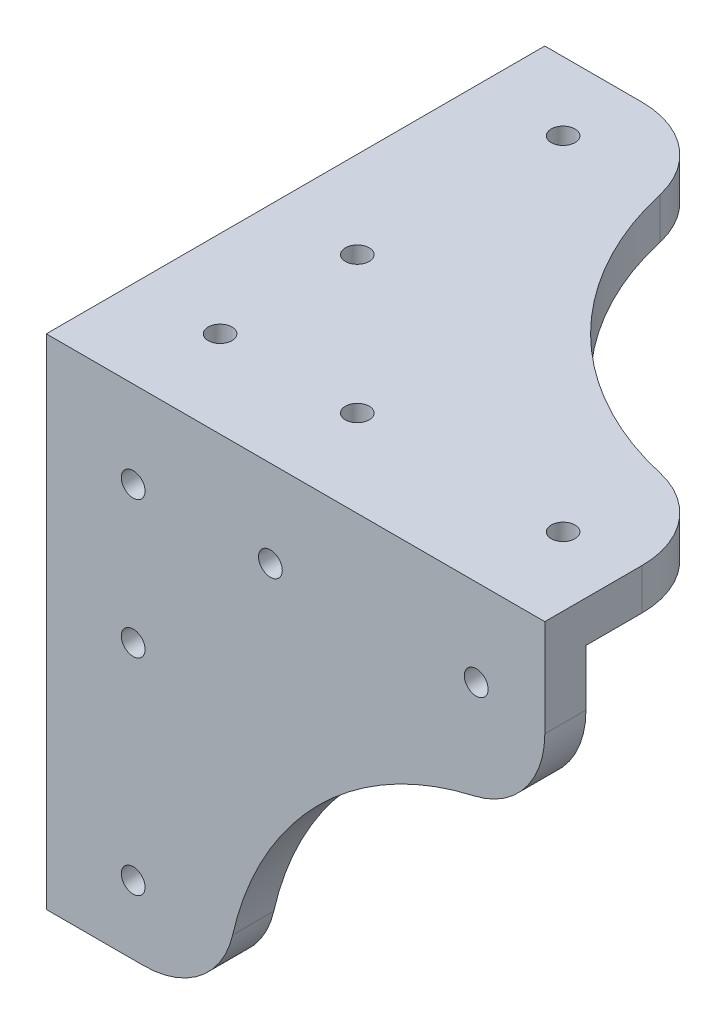
ISO-10303-21;
HEADER;
FILE_DESCRIPTION(('STEP AP214'),'2;1');
FILE_NAME('part.step','',(''),(''),'','','');
FILE_SCHEMA(('AUTOMOTIVE_DESIGN { 1 0 10303 214 1 1 1 1 }'));
ENDSEC;
DATA;
#1=APPLICATION_CONTEXT('core data for automotive mechanical design processes');
#2=APPLICATION_PROTOCOL_DEFINITION('international standard','automotive_design',2000,#1);
#3=PRODUCT_CONTEXT('',#1,'mechanical');
#4=PRODUCT('Part','Part','',(#3));
#5=PRODUCT_RELATED_PRODUCT_CATEGORY('part','',(#4));
#6=PRODUCT_DEFINITION_FORMATION('','',#4);
#7=PRODUCT_DEFINITION_CONTEXT('part definition',#1,'design');
#8=PRODUCT_DEFINITION('design','',#6,#7);
#9=PRODUCT_DEFINITION_SHAPE('','',#8);
#10=(LENGTH_UNIT() NAMED_UNIT(*) SI_UNIT(.MILLI.,.METRE.));
#11=(NAMED_UNIT(*) PLANE_ANGLE_UNIT() SI_UNIT($,.RADIAN.));
#12=(NAMED_UNIT(*) SI_UNIT($,.STERADIAN.) SOLID_ANGLE_UNIT());
#13=UNCERTAINTY_MEASURE_WITH_UNIT(LENGTH_MEASURE(1.E-05),#10,'distance_accuracy_value','');
#14=(GEOMETRIC_REPRESENTATION_CONTEXT(3) GLOBAL_UNCERTAINTY_ASSIGNED_CONTEXT((#13)) GLOBAL_UNIT_ASSIGNED_CONTEXT((#10,
#11,#12)) REPRESENTATION_CONTEXT('',''));
#15=CARTESIAN_POINT('',(0.,0.,0.));
#16=DIRECTION('',(0.,0.,1.));
#17=DIRECTION('',(1.,0.,0.));
#18=AXIS2_PLACEMENT_3D('',#15,#16,#17);
#19=CARTESIAN_POINT('',(109.,-109.,0.));
#20=DIRECTION('',(0.,0.,-1.));
#21=DIRECTION('',(-1.,0.,0.));
#22=AXIS2_PLACEMENT_3D('',#19,#20,#21);
#23=PLANE('',#22);
#24=CARTESIAN_POINT('',(19.,-94.,0.));
#25=DIRECTION('',(0.,0.,-1.));
#26=DIRECTION('',(-1.,0.,0.));
#27=AXIS2_PLACEMENT_3D('',#24,#25,#26);
#28=CIRCLE('',#27,2.6);
#29=CARTESIAN_POINT('',(16.4,-94.,0.));
#30=VERTEX_POINT('',#29);
#31=EDGE_CURVE('E507',#30,#30,#28,.T.);
#32=ORIENTED_EDGE('',*,*,#31,.F.);
#33=EDGE_LOOP('',(#32));
#34=FACE_BOUND('',#33,.T.);
#35=CARTESIAN_POINT('',(19.,-49.,0.));
#36=DIRECTION('',(0.,0.,-1.));
#37=DIRECTION('',(-1.,0.,0.));
#38=AXIS2_PLACEMENT_3D('',#35,#36,#37);
#39=CIRCLE('',#38,2.6);
#40=CARTESIAN_POINT('',(16.4,-49.,0.));
#41=VERTEX_POINT('',#40);
#42=EDGE_CURVE('E517',#41,#41,#39,.T.);
#43=ORIENTED_EDGE('',*,*,#42,.F.);
#44=EDGE_LOOP('',(#43));
#45=FACE_BOUND('',#44,.T.);
#46=CARTESIAN_POINT('',(94.,-19.,0.));
#47=DIRECTION('',(0.,0.,-1.));
#48=DIRECTION('',(-1.,0.,0.));
#49=AXIS2_PLACEMENT_3D('',#46,#47,#48);
#50=CIRCLE('',#49,2.6);
#51=CARTESIAN_POINT('',(91.4,-19.,0.));
#52=VERTEX_POINT('',#51);
#53=EDGE_CURVE('E523',#52,#52,#50,.T.);
#54=ORIENTED_EDGE('',*,*,#53,.F.);
#55=EDGE_LOOP('',(#54));
#56=FACE_BOUND('',#55,.T.);
#57=CARTESIAN_POINT('',(49.,-19.,0.));
#58=DIRECTION('',(0.,0.,-1.));
#59=DIRECTION('',(-1.,0.,0.));
#60=AXIS2_PLACEMENT_3D('',#57,#58,#59);
#61=CIRCLE('',#60,2.6);
#62=CARTESIAN_POINT('',(46.4,-19.,0.));
#63=VERTEX_POINT('',#62);
#64=EDGE_CURVE('E529',#63,#63,#61,.T.);
#65=ORIENTED_EDGE('',*,*,#64,.F.);
#66=EDGE_LOOP('',(#65));
#67=FACE_BOUND('',#66,.T.);
#68=CARTESIAN_POINT('',(19.,-19.,0.));
#69=DIRECTION('',(0.,0.,-1.));
#70=DIRECTION('',(-1.,0.,0.));
#71=AXIS2_PLACEMENT_3D('',#68,#69,#70);
#72=CIRCLE('',#71,2.6);
#73=CARTESIAN_POINT('',(16.4,-19.,0.));
#74=VERTEX_POINT('',#73);
#75=EDGE_CURVE('E534',#74,#74,#72,.T.);
#76=ORIENTED_EDGE('',*,*,#75,.F.);
#77=EDGE_LOOP('',(#76));
#78=FACE_BOUND('',#77,.T.);
#79=CARTESIAN_POINT('',(109.,-109.,0.));
#80=DIRECTION('',(0.,0.,-1.));
#81=DIRECTION('',(-1.,0.,0.));
#82=AXIS2_PLACEMENT_3D('',#79,#80,#81);
#83=CIRCLE('',#82,70.);
#84=CARTESIAN_POINT('',(40.7502769869501,-93.4444444444444,0.));
#85=VERTEX_POINT('',#84);
#86=CARTESIAN_POINT('',(93.4444444444444,-40.7502769869501,0.));
#87=VERTEX_POINT('',#86);
#88=EDGE_CURVE('E174',#85,#87,#83,.T.);
#89=ORIENTED_EDGE('',*,*,#88,.F.);
#90=CARTESIAN_POINT('',(21.2503561260788,-89.,0.));
#91=DIRECTION('',(0.,0.,-1.));
#92=DIRECTION('',(-1.,0.,0.));
#93=AXIS2_PLACEMENT_3D('',#90,#91,#92);
#94=CIRCLE('',#93,20.);
#95=CARTESIAN_POINT('',(21.2503561260788,-109.,0.));
#96=VERTEX_POINT('',#95);
#97=EDGE_CURVE('E173',#85,#96,#94,.T.);
#98=ORIENTED_EDGE('',*,*,#97,.T.);
#99=DIRECTION('',(1.,0.,0.));
#100=VECTOR('',#99,1.);
#101=CARTESIAN_POINT('',(0.,-109.,0.));
#102=LINE('',#101,#100);
#103=CARTESIAN_POINT('',(9.,-109.,0.));
#104=VERTEX_POINT('',#103);
#105=EDGE_CURVE('E154',#104,#96,#102,.T.);
#106=ORIENTED_EDGE('',*,*,#105,.F.);
#107=DIRECTION('',(0.,1.,0.));
#108=VECTOR('',#107,1.);
#109=CARTESIAN_POINT('',(9.,-109.,0.));
#110=LINE('',#109,#108);
#111=CARTESIAN_POINT('',(9.,-9.,0.));
#112=VERTEX_POINT('',#111);
#113=EDGE_CURVE('E160',#104,#112,#110,.T.);
#114=ORIENTED_EDGE('',*,*,#113,.T.);
#115=DIRECTION('',(1.,0.,0.));
#116=VECTOR('',#115,1.);
#117=CARTESIAN_POINT('',(0.,-9.,0.));
#118=LINE('',#117,#116);
#119=CARTESIAN_POINT('',(109.,-9.,0.));
#120=VERTEX_POINT('',#119);
#121=EDGE_CURVE('E280',#112,#120,#118,.T.);
#122=ORIENTED_EDGE('',*,*,#121,.T.);
#123=DIRECTION('',(0.,1.,0.));
#124=VECTOR('',#123,1.);
#125=CARTESIAN_POINT('',(109.,0.,0.));
#126=LINE('',#125,#124);
#127=CARTESIAN_POINT('',(109.,-21.2503561260788,0.));
#128=VERTEX_POINT('',#127);
#129=EDGE_CURVE('E178',#128,#120,#126,.T.);
#130=ORIENTED_EDGE('',*,*,#129,.F.);
#131=CARTESIAN_POINT('',(89.,-21.2503561260788,0.));
#132=DIRECTION('',(0.,0.,-1.));
#133=DIRECTION('',(-1.,0.,0.));
#134=AXIS2_PLACEMENT_3D('',#131,#132,#133);
#135=CIRCLE('',#134,20.);
#136=EDGE_CURVE('E58',#128,#87,#135,.T.);
#137=ORIENTED_EDGE('',*,*,#136,.T.);
#138=EDGE_LOOP('',(#89,#98,#106,#114,#122,#130,#137));
#139=FACE_BOUND('',#138,.T.);
#140=ADVANCED_FACE('F33',(#34,#45,#56,#67,#78,#139),#23,.T.);
#141=CARTESIAN_POINT('',(0.,0.,9.));
#142=DIRECTION('',(1.,0.,0.));
#143=DIRECTION('',(0.,0.,-1.));
#144=AXIS2_PLACEMENT_3D('',#141,#142,#143);
#145=PLANE('',#144);
#146=CARTESIAN_POINT('',(0.,-94.,-9.99999999999999));
#147=DIRECTION('',(-1.,0.,0.));
#148=DIRECTION('',(0.,0.,1.));
#149=AXIS2_PLACEMENT_3D('',#146,#147,#148);
#150=CIRCLE('',#149,2.6);
#151=CARTESIAN_POINT('',(0.,-94.,-7.39999999999999));
#152=VERTEX_POINT('',#151);
#153=EDGE_CURVE('E248',#152,#152,#150,.T.);
#154=ORIENTED_EDGE('',*,*,#153,.F.);
#155=EDGE_LOOP('',(#154));
#156=FACE_BOUND('',#155,.T.);
#157=CARTESIAN_POINT('',(0.,-49.,-9.99999999999999));
#158=DIRECTION('',(-1.,0.,0.));
#159=DIRECTION('',(0.,0.,1.));
#160=AXIS2_PLACEMENT_3D('',#157,#158,#159);
#161=CIRCLE('',#160,2.6);
#162=CARTESIAN_POINT('',(0.,-49.,-7.4));
#163=VERTEX_POINT('',#162);
#164=EDGE_CURVE('E238',#163,#163,#161,.T.);
#165=ORIENTED_EDGE('',*,*,#164,.F.);
#166=EDGE_LOOP('',(#165));
#167=FACE_BOUND('',#166,.T.);
#168=CARTESIAN_POINT('',(0.,-19.,-10.));
#169=DIRECTION('',(-1.,0.,0.));
#170=DIRECTION('',(0.,0.,1.));
#171=AXIS2_PLACEMENT_3D('',#168,#169,#170);
#172=CIRCLE('',#171,2.6);
#173=CARTESIAN_POINT('',(0.,-19.,-7.4));
#174=VERTEX_POINT('',#173);
#175=EDGE_CURVE('E235',#174,#174,#172,.T.);
#176=ORIENTED_EDGE('',*,*,#175,.F.);
#177=EDGE_LOOP('',(#176));
#178=FACE_BOUND('',#177,.T.);
#179=CARTESIAN_POINT('',(0.,-19.,-40.));
#180=DIRECTION('',(-1.,0.,0.));
#181=DIRECTION('',(0.,0.,1.));
#182=AXIS2_PLACEMENT_3D('',#179,#180,#181);
#183=CIRCLE('',#182,2.6);
#184=CARTESIAN_POINT('',(0.,-19.,-37.4));
#185=VERTEX_POINT('',#184);
#186=EDGE_CURVE('E232',#185,#185,#183,.T.);
#187=ORIENTED_EDGE('',*,*,#186,.F.);
#188=EDGE_LOOP('',(#187));
#189=FACE_BOUND('',#188,.T.);
#190=CARTESIAN_POINT('',(0.,-19.,-85.));
#191=DIRECTION('',(-1.,0.,0.));
#192=DIRECTION('',(0.,0.,1.));
#193=AXIS2_PLACEMENT_3D('',#190,#191,#192);
#194=CIRCLE('',#193,2.6);
#195=CARTESIAN_POINT('',(0.,-19.,-82.4));
#196=VERTEX_POINT('',#195);
#197=EDGE_CURVE('E228',#196,#196,#194,.T.);
#198=ORIENTED_EDGE('',*,*,#197,.F.);
#199=EDGE_LOOP('',(#198));
#200=FACE_BOUND('',#199,.T.);
#201=CARTESIAN_POINT('',(0.,-109.,-100.));
#202=DIRECTION('',(1.,0.,0.));
#203=DIRECTION('',(0.,0.,-1.));
#204=AXIS2_PLACEMENT_3D('',#201,#202,#203);
#205=CIRCLE('',#204,70.);
#206=CARTESIAN_POINT('',(0.,-40.7502769869501,-84.4444444444444));
#207=VERTEX_POINT('',#206);
#208=CARTESIAN_POINT('',(0.,-93.4444444444444,-31.7502769869502));
#209=VERTEX_POINT('',#208);
#210=EDGE_CURVE('E207',#207,#209,#205,.T.);
#211=ORIENTED_EDGE('',*,*,#210,.T.);
#212=CARTESIAN_POINT('',(0.,-89.,-12.2503561260788));
#213=DIRECTION('',(1.,0.,0.));
#214=DIRECTION('',(0.,0.,-1.));
#215=AXIS2_PLACEMENT_3D('',#212,#213,#214);
#216=CIRCLE('',#215,20.);
#217=CARTESIAN_POINT('',(0.,-109.,-12.2503561260788));
#218=VERTEX_POINT('',#217);
#219=EDGE_CURVE('E295',#209,#218,#216,.F.);
#220=ORIENTED_EDGE('',*,*,#219,.T.);
#221=DIRECTION('',(0.,0.,-1.));
#222=VECTOR('',#221,1.);
#223=CARTESIAN_POINT('',(0.,-109.,9.));
#224=LINE('',#223,#222);
#225=CARTESIAN_POINT('',(0.,-109.,9.));
#226=VERTEX_POINT('',#225);
#227=EDGE_CURVE('E290',#226,#218,#224,.T.);
#228=ORIENTED_EDGE('',*,*,#227,.F.);
#229=DIRECTION('',(0.,-1.,0.));
#230=VECTOR('',#229,1.);
#231=CARTESIAN_POINT('',(0.,0.,9.));
#232=LINE('',#231,#230);
#233=CARTESIAN_POINT('',(0.,0.,9.));
#234=VERTEX_POINT('',#233);
#235=EDGE_CURVE('E194',#234,#226,#232,.T.);
#236=ORIENTED_EDGE('',*,*,#235,.F.);
#237=DIRECTION('',(0.,0.,-1.));
#238=VECTOR('',#237,1.);
#239=CARTESIAN_POINT('',(0.,0.,9.));
#240=LINE('',#239,#238);
#241=CARTESIAN_POINT('',(0.,0.,-100.));
#242=VERTEX_POINT('',#241);
#243=EDGE_CURVE('E189',#234,#242,#240,.T.);
#244=ORIENTED_EDGE('',*,*,#243,.T.);
#245=DIRECTION('',(0.,1.,0.));
#246=VECTOR('',#245,1.);
#247=CARTESIAN_POINT('',(0.,-9.,-100.));
#248=LINE('',#247,#246);
#249=CARTESIAN_POINT('',(0.,-21.2503561260788,-100.));
#250=VERTEX_POINT('',#249);
#251=EDGE_CURVE('E175',#250,#242,#248,.T.);
#252=ORIENTED_EDGE('',*,*,#251,.F.);
#253=CARTESIAN_POINT('',(0.,-21.2503561260788,-80.));
#254=DIRECTION('',(1.,0.,0.));
#255=DIRECTION('',(0.,0.,-1.));
#256=AXIS2_PLACEMENT_3D('',#253,#254,#255);
#257=CIRCLE('',#256,20.);
#258=EDGE_CURVE('E293',#250,#207,#257,.F.);
#259=ORIENTED_EDGE('',*,*,#258,.T.);
#260=EDGE_LOOP('',(#211,#220,#228,#236,#244,#252,#259));
#261=FACE_BOUND('',#260,.T.);
#262=ADVANCED_FACE('F350',(#156,#167,#178,#189,#200,#261),#145,.F.);
#263=CARTESIAN_POINT('',(0.,-109.,9.));
#264=DIRECTION('',(0.,1.,0.));
#265=DIRECTION('',(0.,0.,1.));
#266=AXIS2_PLACEMENT_3D('',#263,#264,#265);
#267=PLANE('',#266);
#268=ORIENTED_EDGE('',*,*,#227,.T.);
#269=DIRECTION('',(1.,0.,0.));
#270=VECTOR('',#269,1.);
#271=CARTESIAN_POINT('',(9.,-109.,-12.2503561260788));
#272=LINE('',#271,#270);
#273=CARTESIAN_POINT('',(9.,-109.,-12.2503561260788));
#274=VERTEX_POINT('',#273);
#275=EDGE_CURVE('E157',#218,#274,#272,.T.);
#276=ORIENTED_EDGE('',*,*,#275,.T.);
#277=DIRECTION('',(0.,0.,1.));
#278=VECTOR('',#277,1.);
#279=CARTESIAN_POINT('',(9.,-109.,-30.));
#280=LINE('',#279,#278);
#281=EDGE_CURVE('E149',#274,#104,#280,.T.);
#282=ORIENTED_EDGE('',*,*,#281,.T.);
#283=ORIENTED_EDGE('',*,*,#105,.T.);
#284=DIRECTION('',(0.,0.,-1.));
#285=VECTOR('',#284,1.);
#286=CARTESIAN_POINT('',(21.2503561260788,-109.,9.));
#287=LINE('',#286,#285);
#288=CARTESIAN_POINT('',(21.2503561260788,-109.,9.));
#289=VERTEX_POINT('',#288);
#290=EDGE_CURVE('E297',#96,#289,#287,.F.);
#291=ORIENTED_EDGE('',*,*,#290,.T.);
#292=DIRECTION('',(1.,0.,0.));
#293=VECTOR('',#292,1.);
#294=CARTESIAN_POINT('',(0.,-109.,9.));
#295=LINE('',#294,#293);
#296=EDGE_CURVE('E411',#226,#289,#295,.T.);
#297=ORIENTED_EDGE('',*,*,#296,.F.);
#298=EDGE_LOOP('',(#268,#276,#282,#283,#291,#297));
#299=FACE_BOUND('',#298,.T.);
#300=ADVANCED_FACE('F152',(#299),#267,.F.);
#301=CARTESIAN_POINT('',(109.,-109.,9.));
#302=DIRECTION('',(0.,0.,-1.));
#303=DIRECTION('',(-1.,0.,0.));
#304=AXIS2_PLACEMENT_3D('',#301,#302,#303);
#305=CYLINDRICAL_SURFACE('',#304,70.);
#306=CARTESIAN_POINT('',(109.,-109.,9.));
#307=DIRECTION('',(0.,0.,-1.));
#308=DIRECTION('',(-1.,0.,0.));
#309=AXIS2_PLACEMENT_3D('',#306,#307,#308);
#310=CIRCLE('',#309,70.);
#311=CARTESIAN_POINT('',(40.7502769869501,-93.4444444444444,9.));
#312=VERTEX_POINT('',#311);
#313=CARTESIAN_POINT('',(93.4444444444444,-40.7502769869501,9.));
#314=VERTEX_POINT('',#313);
#315=EDGE_CURVE('E327',#312,#314,#310,.T.);
#316=ORIENTED_EDGE('',*,*,#315,.F.);
#317=DIRECTION('',(0.,0.,-1.));
#318=VECTOR('',#317,1.);
#319=CARTESIAN_POINT('',(40.7502769869501,-93.4444444444444,9.));
#320=LINE('',#319,#318);
#321=EDGE_CURVE('E195',#312,#85,#320,.T.);
#322=ORIENTED_EDGE('',*,*,#321,.T.);
#323=ORIENTED_EDGE('',*,*,#88,.T.);
#324=DIRECTION('',(0.,0.,-1.));
#325=VECTOR('',#324,1.);
#326=CARTESIAN_POINT('',(93.4444444444444,-40.7502769869501,9.));
#327=LINE('',#326,#325);
#328=EDGE_CURVE('E321',#87,#314,#327,.F.);
#329=ORIENTED_EDGE('',*,*,#328,.T.);
#330=EDGE_LOOP('',(#316,#322,#323,#329));
#331=FACE_BOUND('',#330,.T.);
#332=ADVANCED_FACE('F326',(#331),#305,.F.);
#333=CARTESIAN_POINT('',(109.,0.,9.));
#334=DIRECTION('',(-1.,0.,0.));
#335=DIRECTION('',(0.,0.,1.));
#336=AXIS2_PLACEMENT_3D('',#333,#334,#335);
#337=PLANE('',#336);
#338=DIRECTION('',(0.,1.,0.));
#339=VECTOR('',#338,1.);
#340=CARTESIAN_POINT('',(109.,0.,9.));
#341=LINE('',#340,#339);
#342=CARTESIAN_POINT('',(109.,-21.2503561260788,9.));
#343=VERTEX_POINT('',#342);
#344=CARTESIAN_POINT('',(109.,0.,9.));
#345=VERTEX_POINT('',#344);
#346=EDGE_CURVE('E337',#343,#345,#341,.T.);
#347=ORIENTED_EDGE('',*,*,#346,.F.);
#348=DIRECTION('',(0.,0.,-1.));
#349=VECTOR('',#348,1.);
#350=CARTESIAN_POINT('',(109.,-21.2503561260788,9.));
#351=LINE('',#350,#349);
#352=EDGE_CURVE('E11',#343,#128,#351,.T.);
#353=ORIENTED_EDGE('',*,*,#352,.T.);
#354=ORIENTED_EDGE('',*,*,#129,.T.);
#355=DIRECTION('',(0.,0.,-1.));
#356=VECTOR('',#355,1.);
#357=CARTESIAN_POINT('',(109.,-9.,0.));
#358=LINE('',#357,#356);
#359=CARTESIAN_POINT('',(109.,-9.,-12.2503561260788));
#360=VERTEX_POINT('',#359);
#361=EDGE_CURVE('E283',#120,#360,#358,.T.);
#362=ORIENTED_EDGE('',*,*,#361,.T.);
#363=DIRECTION('',(0.,-1.,0.));
#364=VECTOR('',#363,1.);
#365=CARTESIAN_POINT('',(109.,0.,-12.2503561260788));
#366=LINE('',#365,#364);
#367=CARTESIAN_POINT('',(109.,0.,-12.2503561260788));
#368=VERTEX_POINT('',#367);
#369=EDGE_CURVE('E42',#360,#368,#366,.F.);
#370=ORIENTED_EDGE('',*,*,#369,.T.);
#371=DIRECTION('',(0.,0.,-1.));
#372=VECTOR('',#371,1.);
#373=CARTESIAN_POINT('',(109.,0.,9.));
#374=LINE('',#373,#372);
#375=EDGE_CURVE('E401',#345,#368,#374,.T.);
#376=ORIENTED_EDGE('',*,*,#375,.F.);
#377=EDGE_LOOP('',(#347,#353,#354,#362,#370,#376));
#378=FACE_BOUND('',#377,.T.);
#379=ADVANCED_FACE('F334',(#378),#337,.F.);
#380=CARTESIAN_POINT('',(0.,0.,9.));
#381=DIRECTION('',(0.,-1.,0.));
#382=DIRECTION('',(0.,0.,-1.));
#383=AXIS2_PLACEMENT_3D('',#380,#381,#382);
#384=PLANE('',#383);
#385=CARTESIAN_POINT('',(19.,0.,-40.));
#386=DIRECTION('',(0.,1.,0.));
#387=DIRECTION('',(0.,0.,1.));
#388=AXIS2_PLACEMENT_3D('',#385,#386,#387);
#389=CIRCLE('',#388,2.6);
#390=CARTESIAN_POINT('',(19.,0.,-37.4));
#391=VERTEX_POINT('',#390);
#392=EDGE_CURVE('E224',#391,#391,#389,.T.);
#393=ORIENTED_EDGE('',*,*,#392,.F.);
#394=EDGE_LOOP('',(#393));
#395=FACE_BOUND('',#394,.T.);
#396=CARTESIAN_POINT('',(49.,0.,-9.99999999999999));
#397=DIRECTION('',(0.,1.,0.));
#398=DIRECTION('',(0.,0.,1.));
#399=AXIS2_PLACEMENT_3D('',#396,#397,#398);
#400=CIRCLE('',#399,2.6);
#401=CARTESIAN_POINT('',(49.,0.,-7.39999999999999));
#402=VERTEX_POINT('',#401);
#403=EDGE_CURVE('E220',#402,#402,#400,.T.);
#404=ORIENTED_EDGE('',*,*,#403,.F.);
#405=EDGE_LOOP('',(#404));
#406=FACE_BOUND('',#405,.T.);
#407=CARTESIAN_POINT('',(94.,0.,-10.));
#408=DIRECTION('',(0.,1.,0.));
#409=DIRECTION('',(0.,0.,1.));
#410=AXIS2_PLACEMENT_3D('',#407,#408,#409);
#411=CIRCLE('',#410,2.6);
#412=CARTESIAN_POINT('',(94.,0.,-7.39999999999999));
#413=VERTEX_POINT('',#412);
#414=EDGE_CURVE('E216',#413,#413,#411,.T.);
#415=ORIENTED_EDGE('',*,*,#414,.F.);
#416=EDGE_LOOP('',(#415));
#417=FACE_BOUND('',#416,.T.);
#418=CARTESIAN_POINT('',(19.,0.,-9.99999999999998));
#419=DIRECTION('',(0.,1.,0.));
#420=DIRECTION('',(0.,0.,1.));
#421=AXIS2_PLACEMENT_3D('',#418,#419,#420);
#422=CIRCLE('',#421,2.6);
#423=CARTESIAN_POINT('',(19.,0.,-7.39999999999998));
#424=VERTEX_POINT('',#423);
#425=EDGE_CURVE('E212',#424,#424,#422,.T.);
#426=ORIENTED_EDGE('',*,*,#425,.F.);
#427=EDGE_LOOP('',(#426));
#428=FACE_BOUND('',#427,.T.);
#429=CARTESIAN_POINT('',(19.,0.,-85.));
#430=DIRECTION('',(0.,1.,0.));
#431=DIRECTION('',(0.,0.,1.));
#432=AXIS2_PLACEMENT_3D('',#429,#430,#431);
#433=CIRCLE('',#432,2.6);
#434=CARTESIAN_POINT('',(19.,0.,-82.4));
#435=VERTEX_POINT('',#434);
#436=EDGE_CURVE('E208',#435,#435,#433,.T.);
#437=ORIENTED_EDGE('',*,*,#436,.F.);
#438=EDGE_LOOP('',(#437));
#439=FACE_BOUND('',#438,.T.);
#440=CARTESIAN_POINT('',(109.,0.,-100.));
#441=DIRECTION('',(0.,-1.,0.));
#442=DIRECTION('',(0.,0.,1.));
#443=AXIS2_PLACEMENT_3D('',#440,#441,#442);
#444=CIRCLE('',#443,70.);
#445=CARTESIAN_POINT('',(93.4444444444444,0.,-31.7502769869502));
#446=VERTEX_POINT('',#445);
#447=CARTESIAN_POINT('',(40.7502769869501,0.,-84.4444444444444));
#448=VERTEX_POINT('',#447);
#449=EDGE_CURVE('E272',#446,#448,#444,.T.);
#450=ORIENTED_EDGE('',*,*,#449,.T.);
#451=CARTESIAN_POINT('',(21.2503561260788,0.,-80.));
#452=DIRECTION('',(0.,-1.,0.));
#453=DIRECTION('',(0.,0.,-1.));
#454=AXIS2_PLACEMENT_3D('',#451,#452,#453);
#455=CIRCLE('',#454,20.);
#456=CARTESIAN_POINT('',(21.2503561260788,0.,-100.));
#457=VERTEX_POINT('',#456);
#458=EDGE_CURVE('E316',#448,#457,#455,.F.);
#459=ORIENTED_EDGE('',*,*,#458,.T.);
#460=DIRECTION('',(-1.,0.,0.));
#461=VECTOR('',#460,1.);
#462=CARTESIAN_POINT('',(0.,0.,-100.));
#463=LINE('',#462,#461);
#464=EDGE_CURVE('E284',#457,#242,#463,.T.);
#465=ORIENTED_EDGE('',*,*,#464,.T.);
#466=ORIENTED_EDGE('',*,*,#243,.F.);
#467=DIRECTION('',(-1.,0.,0.));
#468=VECTOR('',#467,1.);
#469=CARTESIAN_POINT('',(0.,0.,9.));
#470=LINE('',#469,#468);
#471=EDGE_CURVE('E184',#345,#234,#470,.T.);
#472=ORIENTED_EDGE('',*,*,#471,.F.);
#473=ORIENTED_EDGE('',*,*,#375,.T.);
#474=CARTESIAN_POINT('',(89.,0.,-12.2503561260788));
#475=DIRECTION('',(0.,-1.,0.));
#476=DIRECTION('',(0.,0.,-1.));
#477=AXIS2_PLACEMENT_3D('',#474,#475,#476);
#478=CIRCLE('',#477,20.);
#479=EDGE_CURVE('E314',#368,#446,#478,.F.);
#480=ORIENTED_EDGE('',*,*,#479,.T.);
#481=EDGE_LOOP('',(#450,#459,#465,#466,#472,#473,#480));
#482=FACE_BOUND('',#481,.T.);
#483=ADVANCED_FACE('F364',(#395,#406,#417,#428,#439,#482),#384,.F.);
#484=CARTESIAN_POINT('',(109.,-109.,9.));
#485=DIRECTION('',(0.,0.,-1.));
#486=DIRECTION('',(-1.,0.,0.));
#487=AXIS2_PLACEMENT_3D('',#484,#485,#486);
#488=PLANE('',#487);
#489=CARTESIAN_POINT('',(19.,-94.,9.));
#490=DIRECTION('',(0.,0.,1.));
#491=DIRECTION('',(1.,0.,0.));
#492=AXIS2_PLACEMENT_3D('',#489,#490,#491);
#493=CIRCLE('',#492,2.6);
#494=CARTESIAN_POINT('',(21.6,-94.,9.));
#495=VERTEX_POINT('',#494);
#496=EDGE_CURVE('E510',#495,#495,#493,.T.);
#497=ORIENTED_EDGE('',*,*,#496,.F.);
#498=EDGE_LOOP('',(#497));
#499=FACE_BOUND('',#498,.T.);
#500=CARTESIAN_POINT('',(19.,-49.,9.));
#501=DIRECTION('',(0.,0.,1.));
#502=DIRECTION('',(1.,0.,0.));
#503=AXIS2_PLACEMENT_3D('',#500,#501,#502);
#504=CIRCLE('',#503,2.6);
#505=CARTESIAN_POINT('',(21.6,-49.,9.));
#506=VERTEX_POINT('',#505);
#507=EDGE_CURVE('E512',#506,#506,#504,.T.);
#508=ORIENTED_EDGE('',*,*,#507,.F.);
#509=EDGE_LOOP('',(#508));
#510=FACE_BOUND('',#509,.T.);
#511=CARTESIAN_POINT('',(94.,-19.,9.));
#512=DIRECTION('',(0.,0.,1.));
#513=DIRECTION('',(1.,0.,0.));
#514=AXIS2_PLACEMENT_3D('',#511,#512,#513);
#515=CIRCLE('',#514,2.6);
#516=CARTESIAN_POINT('',(96.6,-19.,9.));
#517=VERTEX_POINT('',#516);
#518=EDGE_CURVE('E520',#517,#517,#515,.T.);
#519=ORIENTED_EDGE('',*,*,#518,.F.);
#520=EDGE_LOOP('',(#519));
#521=FACE_BOUND('',#520,.T.);
#522=CARTESIAN_POINT('',(49.,-19.,9.));
#523=DIRECTION('',(0.,0.,1.));
#524=DIRECTION('',(1.,0.,0.));
#525=AXIS2_PLACEMENT_3D('',#522,#523,#524);
#526=CIRCLE('',#525,2.6);
#527=CARTESIAN_POINT('',(51.6,-19.,9.));
#528=VERTEX_POINT('',#527);
#529=EDGE_CURVE('E526',#528,#528,#526,.T.);
#530=ORIENTED_EDGE('',*,*,#529,.F.);
#531=EDGE_LOOP('',(#530));
#532=FACE_BOUND('',#531,.T.);
#533=CARTESIAN_POINT('',(19.,-19.,9.));
#534=DIRECTION('',(0.,0.,1.));
#535=DIRECTION('',(1.,0.,0.));
#536=AXIS2_PLACEMENT_3D('',#533,#534,#535);
#537=CIRCLE('',#536,2.6);
#538=CARTESIAN_POINT('',(21.6,-19.,9.));
#539=VERTEX_POINT('',#538);
#540=EDGE_CURVE('E532',#539,#539,#537,.T.);
#541=ORIENTED_EDGE('',*,*,#540,.F.);
#542=EDGE_LOOP('',(#541));
#543=FACE_BOUND('',#542,.T.);
#544=ORIENTED_EDGE('',*,*,#296,.T.);
#545=CARTESIAN_POINT('',(21.2503561260788,-89.,9.));
#546=DIRECTION('',(0.,0.,-1.));
#547=DIRECTION('',(-1.,0.,0.));
#548=AXIS2_PLACEMENT_3D('',#545,#546,#547);
#549=CIRCLE('',#548,20.);
#550=EDGE_CURVE('E200',#289,#312,#549,.F.);
#551=ORIENTED_EDGE('',*,*,#550,.T.);
#552=ORIENTED_EDGE('',*,*,#315,.T.);
#553=CARTESIAN_POINT('',(89.,-21.2503561260788,9.));
#554=DIRECTION('',(0.,0.,-1.));
#555=DIRECTION('',(-1.,0.,0.));
#556=AXIS2_PLACEMENT_3D('',#553,#554,#555);
#557=CIRCLE('',#556,20.);
#558=EDGE_CURVE('E50',#314,#343,#557,.F.);
#559=ORIENTED_EDGE('',*,*,#558,.T.);
#560=ORIENTED_EDGE('',*,*,#346,.T.);
#561=ORIENTED_EDGE('',*,*,#471,.T.);
#562=ORIENTED_EDGE('',*,*,#235,.T.);
#563=EDGE_LOOP('',(#544,#551,#552,#559,#560,#561,#562));
#564=FACE_BOUND('',#563,.T.);
#565=ADVANCED_FACE('F362',(#499,#510,#521,#532,#543,#564),#488,.F.);
#566=CARTESIAN_POINT('',(0.,-9.,-100.));
#567=DIRECTION('',(0.,0.,-1.));
#568=DIRECTION('',(-1.,0.,0.));
#569=AXIS2_PLACEMENT_3D('',#566,#567,#568);
#570=PLANE('',#569);
#571=DIRECTION('',(0.,-1.,0.));
#572=VECTOR('',#571,1.);
#573=CARTESIAN_POINT('',(9.,-9.,-100.));
#574=LINE('',#573,#572);
#575=CARTESIAN_POINT('',(9.,-9.,-100.));
#576=VERTEX_POINT('',#575);
#577=CARTESIAN_POINT('',(9.,-21.2503561260788,-100.));
#578=VERTEX_POINT('',#577);
#579=EDGE_CURVE('E269',#576,#578,#574,.T.);
#580=ORIENTED_EDGE('',*,*,#579,.T.);
#581=DIRECTION('',(-1.,0.,0.));
#582=VECTOR('',#581,1.);
#583=CARTESIAN_POINT('',(0.,-21.2503561260788,-100.));
#584=LINE('',#583,#582);
#585=EDGE_CURVE('E306',#578,#250,#584,.T.);
#586=ORIENTED_EDGE('',*,*,#585,.T.);
#587=ORIENTED_EDGE('',*,*,#251,.T.);
#588=ORIENTED_EDGE('',*,*,#464,.F.);
#589=DIRECTION('',(0.,1.,0.));
#590=VECTOR('',#589,1.);
#591=CARTESIAN_POINT('',(21.2503561260788,-9.,-100.));
#592=LINE('',#591,#590);
#593=CARTESIAN_POINT('',(21.2503561260788,-9.,-100.));
#594=VERTEX_POINT('',#593);
#595=EDGE_CURVE('E304',#457,#594,#592,.F.);
#596=ORIENTED_EDGE('',*,*,#595,.T.);
#597=DIRECTION('',(-1.,0.,0.));
#598=VECTOR('',#597,1.);
#599=CARTESIAN_POINT('',(0.,-9.,-100.));
#600=LINE('',#599,#598);
#601=EDGE_CURVE('E181',#594,#576,#600,.T.);
#602=ORIENTED_EDGE('',*,*,#601,.T.);
#603=EDGE_LOOP('',(#580,#586,#587,#588,#596,#602));
#604=FACE_BOUND('',#603,.T.);
#605=ADVANCED_FACE('F429',(#604),#570,.T.);
#606=CARTESIAN_POINT('',(109.,-9.,-100.));
#607=DIRECTION('',(0.,1.,0.));
#608=DIRECTION('',(0.,0.,1.));
#609=AXIS2_PLACEMENT_3D('',#606,#607,#608);
#610=CYLINDRICAL_SURFACE('',#609,70.);
#611=CARTESIAN_POINT('',(109.,-9.,-100.));
#612=DIRECTION('',(0.,-1.,0.));
#613=DIRECTION('',(0.,0.,1.));
#614=AXIS2_PLACEMENT_3D('',#611,#612,#613);
#615=CIRCLE('',#614,70.);
#616=CARTESIAN_POINT('',(93.4444444444444,-9.,-31.7502769869502));
#617=VERTEX_POINT('',#616);
#618=CARTESIAN_POINT('',(40.7502769869501,-9.,-84.4444444444444));
#619=VERTEX_POINT('',#618);
#620=EDGE_CURVE('E277',#617,#619,#615,.T.);
#621=ORIENTED_EDGE('',*,*,#620,.T.);
#622=DIRECTION('',(0.,1.,0.));
#623=VECTOR('',#622,1.);
#624=CARTESIAN_POINT('',(40.7502769869501,-9.,-84.4444444444444));
#625=LINE('',#624,#623);
#626=EDGE_CURVE('E311',#619,#448,#625,.T.);
#627=ORIENTED_EDGE('',*,*,#626,.T.);
#628=ORIENTED_EDGE('',*,*,#449,.F.);
#629=DIRECTION('',(0.,1.,0.));
#630=VECTOR('',#629,1.);
#631=CARTESIAN_POINT('',(93.4444444444444,-9.,-31.7502769869502));
#632=LINE('',#631,#630);
#633=EDGE_CURVE('E309',#446,#617,#632,.F.);
#634=ORIENTED_EDGE('',*,*,#633,.T.);
#635=EDGE_LOOP('',(#621,#627,#628,#634));
#636=FACE_BOUND('',#635,.T.);
#637=ADVANCED_FACE('F396',(#636),#610,.F.);
#638=CARTESIAN_POINT('',(109.,-9.,-100.));
#639=DIRECTION('',(0.,1.,0.));
#640=DIRECTION('',(0.,0.,1.));
#641=AXIS2_PLACEMENT_3D('',#638,#639,#640);
#642=PLANE('',#641);
#643=CARTESIAN_POINT('',(19.,-8.99999999999999,-40.));
#644=DIRECTION('',(0.,1.,0.));
#645=DIRECTION('',(0.,0.,1.));
#646=AXIS2_PLACEMENT_3D('',#643,#644,#645);
#647=CIRCLE('',#646,2.6);
#648=CARTESIAN_POINT('',(19.,-8.99999999999999,-37.4));
#649=VERTEX_POINT('',#648);
#650=EDGE_CURVE('E221',#649,#649,#647,.T.);
#651=ORIENTED_EDGE('',*,*,#650,.T.);
#652=EDGE_LOOP('',(#651));
#653=FACE_BOUND('',#652,.T.);
#654=CARTESIAN_POINT('',(49.,-8.99999999999999,-9.99999999999999));
#655=DIRECTION('',(0.,1.,0.));
#656=DIRECTION('',(0.,0.,1.));
#657=AXIS2_PLACEMENT_3D('',#654,#655,#656);
#658=CIRCLE('',#657,2.6);
#659=CARTESIAN_POINT('',(49.,-8.99999999999999,-7.39999999999999));
#660=VERTEX_POINT('',#659);
#661=EDGE_CURVE('E217',#660,#660,#658,.T.);
#662=ORIENTED_EDGE('',*,*,#661,.T.);
#663=EDGE_LOOP('',(#662));
#664=FACE_BOUND('',#663,.T.);
#665=CARTESIAN_POINT('',(94.,-8.99999999999999,-10.));
#666=DIRECTION('',(0.,1.,0.));
#667=DIRECTION('',(0.,0.,1.));
#668=AXIS2_PLACEMENT_3D('',#665,#666,#667);
#669=CIRCLE('',#668,2.6);
#670=CARTESIAN_POINT('',(94.,-8.99999999999999,-7.39999999999999));
#671=VERTEX_POINT('',#670);
#672=EDGE_CURVE('E213',#671,#671,#669,.T.);
#673=ORIENTED_EDGE('',*,*,#672,.T.);
#674=EDGE_LOOP('',(#673));
#675=FACE_BOUND('',#674,.T.);
#676=CARTESIAN_POINT('',(19.,-8.99999999999999,-9.99999999999998));
#677=DIRECTION('',(0.,1.,0.));
#678=DIRECTION('',(0.,0.,1.));
#679=AXIS2_PLACEMENT_3D('',#676,#677,#678);
#680=CIRCLE('',#679,2.6);
#681=CARTESIAN_POINT('',(19.,-8.99999999999999,-7.39999999999998));
#682=VERTEX_POINT('',#681);
#683=EDGE_CURVE('E209',#682,#682,#680,.T.);
#684=ORIENTED_EDGE('',*,*,#683,.T.);
#685=EDGE_LOOP('',(#684));
#686=FACE_BOUND('',#685,.T.);
#687=CARTESIAN_POINT('',(19.,-8.99999999999999,-85.));
#688=DIRECTION('',(0.,1.,0.));
#689=DIRECTION('',(0.,0.,1.));
#690=AXIS2_PLACEMENT_3D('',#687,#688,#689);
#691=CIRCLE('',#690,2.6);
#692=CARTESIAN_POINT('',(19.,-8.99999999999999,-82.4));
#693=VERTEX_POINT('',#692);
#694=EDGE_CURVE('E204',#693,#693,#691,.T.);
#695=ORIENTED_EDGE('',*,*,#694,.T.);
#696=EDGE_LOOP('',(#695));
#697=FACE_BOUND('',#696,.T.);
#698=ORIENTED_EDGE('',*,*,#601,.F.);
#699=CARTESIAN_POINT('',(21.2503561260788,-9.,-80.));
#700=DIRECTION('',(0.,1.,0.));
#701=DIRECTION('',(0.,0.,1.));
#702=AXIS2_PLACEMENT_3D('',#699,#700,#701);
#703=CIRCLE('',#702,20.);
#704=EDGE_CURVE('E320',#594,#619,#703,.F.);
#705=ORIENTED_EDGE('',*,*,#704,.T.);
#706=ORIENTED_EDGE('',*,*,#620,.F.);
#707=CARTESIAN_POINT('',(89.,-9.,-12.2503561260788));
#708=DIRECTION('',(0.,1.,0.));
#709=DIRECTION('',(0.,0.,1.));
#710=AXIS2_PLACEMENT_3D('',#707,#708,#709);
#711=CIRCLE('',#710,20.);
#712=EDGE_CURVE('E318',#617,#360,#711,.F.);
#713=ORIENTED_EDGE('',*,*,#712,.T.);
#714=ORIENTED_EDGE('',*,*,#361,.F.);
#715=ORIENTED_EDGE('',*,*,#121,.F.);
#716=DIRECTION('',(0.,0.,-1.));
#717=VECTOR('',#716,1.);
#718=CARTESIAN_POINT('',(9.,-9.,0.));
#719=LINE('',#718,#717);
#720=EDGE_CURVE('E167',#112,#576,#719,.T.);
#721=ORIENTED_EDGE('',*,*,#720,.T.);
#722=EDGE_LOOP('',(#698,#705,#706,#713,#714,#715,#721));
#723=FACE_BOUND('',#722,.T.);
#724=ADVANCED_FACE('F393',(#653,#664,#675,#686,#697,#723),#642,.F.);
#725=CARTESIAN_POINT('',(9.,-109.,-100.));
#726=DIRECTION('',(-1.,0.,0.));
#727=DIRECTION('',(0.,0.,1.));
#728=AXIS2_PLACEMENT_3D('',#725,#726,#727);
#729=CYLINDRICAL_SURFACE('',#728,70.);
#730=CARTESIAN_POINT('',(9.,-109.,-100.));
#731=DIRECTION('',(1.,0.,0.));
#732=DIRECTION('',(0.,0.,-1.));
#733=AXIS2_PLACEMENT_3D('',#730,#731,#732);
#734=CIRCLE('',#733,70.);
#735=CARTESIAN_POINT('',(9.,-40.7502769869501,-84.4444444444444));
#736=VERTEX_POINT('',#735);
#737=CARTESIAN_POINT('',(9.,-93.4444444444444,-31.7502769869502));
#738=VERTEX_POINT('',#737);
#739=EDGE_CURVE('E161',#736,#738,#734,.T.);
#740=ORIENTED_EDGE('',*,*,#739,.T.);
#741=DIRECTION('',(-1.,0.,0.));
#742=VECTOR('',#741,1.);
#743=CARTESIAN_POINT('',(9.,-93.4444444444444,-31.7502769869502));
#744=LINE('',#743,#742);
#745=EDGE_CURVE('E289',#738,#209,#744,.T.);
#746=ORIENTED_EDGE('',*,*,#745,.T.);
#747=ORIENTED_EDGE('',*,*,#210,.F.);
#748=DIRECTION('',(-1.,0.,0.));
#749=VECTOR('',#748,1.);
#750=CARTESIAN_POINT('',(9.,-40.7502769869501,-84.4444444444444));
#751=LINE('',#750,#749);
#752=EDGE_CURVE('E287',#207,#736,#751,.F.);
#753=ORIENTED_EDGE('',*,*,#752,.T.);
#754=EDGE_LOOP('',(#740,#746,#747,#753));
#755=FACE_BOUND('',#754,.T.);
#756=ADVANCED_FACE('F424',(#755),#729,.F.);
#757=CARTESIAN_POINT('',(9.,-109.,-100.));
#758=DIRECTION('',(1.,0.,0.));
#759=DIRECTION('',(0.,0.,-1.));
#760=AXIS2_PLACEMENT_3D('',#757,#758,#759);
#761=PLANE('',#760);
#762=CARTESIAN_POINT('',(8.99999999999999,-94.,-9.99999999999999));
#763=DIRECTION('',(1.,0.,0.));
#764=DIRECTION('',(0.,0.,-1.));
#765=AXIS2_PLACEMENT_3D('',#762,#763,#764);
#766=CIRCLE('',#765,2.6);
#767=CARTESIAN_POINT('',(8.99999999999999,-94.,-12.6));
#768=VERTEX_POINT('',#767);
#769=EDGE_CURVE('E37',#768,#768,#766,.T.);
#770=ORIENTED_EDGE('',*,*,#769,.F.);
#771=EDGE_LOOP('',(#770));
#772=FACE_BOUND('',#771,.T.);
#773=CARTESIAN_POINT('',(8.99999999999999,-49.,-9.99999999999999));
#774=DIRECTION('',(1.,0.,0.));
#775=DIRECTION('',(0.,0.,-1.));
#776=AXIS2_PLACEMENT_3D('',#773,#774,#775);
#777=CIRCLE('',#776,2.6);
#778=CARTESIAN_POINT('',(8.99999999999999,-49.,-12.6));
#779=VERTEX_POINT('',#778);
#780=EDGE_CURVE('E236',#779,#779,#777,.T.);
#781=ORIENTED_EDGE('',*,*,#780,.F.);
#782=EDGE_LOOP('',(#781));
#783=FACE_BOUND('',#782,.T.);
#784=CARTESIAN_POINT('',(8.99999999999999,-19.,-10.));
#785=DIRECTION('',(1.,0.,0.));
#786=DIRECTION('',(0.,0.,-1.));
#787=AXIS2_PLACEMENT_3D('',#784,#785,#786);
#788=CIRCLE('',#787,2.6);
#789=CARTESIAN_POINT('',(8.99999999999999,-19.,-12.6));
#790=VERTEX_POINT('',#789);
#791=EDGE_CURVE('E233',#790,#790,#788,.T.);
#792=ORIENTED_EDGE('',*,*,#791,.F.);
#793=EDGE_LOOP('',(#792));
#794=FACE_BOUND('',#793,.T.);
#795=CARTESIAN_POINT('',(8.99999999999999,-19.,-40.));
#796=DIRECTION('',(1.,0.,0.));
#797=DIRECTION('',(0.,0.,-1.));
#798=AXIS2_PLACEMENT_3D('',#795,#796,#797);
#799=CIRCLE('',#798,2.6);
#800=CARTESIAN_POINT('',(8.99999999999999,-19.,-42.6));
#801=VERTEX_POINT('',#800);
#802=EDGE_CURVE('E229',#801,#801,#799,.T.);
#803=ORIENTED_EDGE('',*,*,#802,.F.);
#804=EDGE_LOOP('',(#803));
#805=FACE_BOUND('',#804,.T.);
#806=CARTESIAN_POINT('',(8.99999999999999,-19.,-85.));
#807=DIRECTION('',(1.,0.,0.));
#808=DIRECTION('',(0.,0.,-1.));
#809=AXIS2_PLACEMENT_3D('',#806,#807,#808);
#810=CIRCLE('',#809,2.6);
#811=CARTESIAN_POINT('',(8.99999999999999,-19.,-87.6));
#812=VERTEX_POINT('',#811);
#813=EDGE_CURVE('E225',#812,#812,#810,.T.);
#814=ORIENTED_EDGE('',*,*,#813,.F.);
#815=EDGE_LOOP('',(#814));
#816=FACE_BOUND('',#815,.T.);
#817=ORIENTED_EDGE('',*,*,#281,.F.);
#818=CARTESIAN_POINT('',(9.,-89.,-12.2503561260788));
#819=DIRECTION('',(1.,0.,0.));
#820=DIRECTION('',(0.,0.,-1.));
#821=AXIS2_PLACEMENT_3D('',#818,#819,#820);
#822=CIRCLE('',#821,20.);
#823=EDGE_CURVE('E302',#274,#738,#822,.T.);
#824=ORIENTED_EDGE('',*,*,#823,.T.);
#825=ORIENTED_EDGE('',*,*,#739,.F.);
#826=CARTESIAN_POINT('',(9.,-21.2503561260788,-80.));
#827=DIRECTION('',(1.,0.,0.));
#828=DIRECTION('',(0.,0.,-1.));
#829=AXIS2_PLACEMENT_3D('',#826,#827,#828);
#830=CIRCLE('',#829,20.);
#831=EDGE_CURVE('E300',#736,#578,#830,.T.);
#832=ORIENTED_EDGE('',*,*,#831,.T.);
#833=ORIENTED_EDGE('',*,*,#579,.F.);
#834=ORIENTED_EDGE('',*,*,#720,.F.);
#835=ORIENTED_EDGE('',*,*,#113,.F.);
#836=EDGE_LOOP('',(#817,#824,#825,#832,#833,#834,#835));
#837=FACE_BOUND('',#836,.T.);
#838=ADVANCED_FACE('F164',(#772,#783,#794,#805,#816,#837),#761,.T.);
#839=CARTESIAN_POINT('',(9.,-89.,-12.2503561260788));
#840=DIRECTION('',(-1.,0.,0.));
#841=DIRECTION('',(0.,0.,1.));
#842=AXIS2_PLACEMENT_3D('',#839,#840,#841);
#843=CYLINDRICAL_SURFACE('',#842,20.);
#844=ORIENTED_EDGE('',*,*,#823,.F.);
#845=ORIENTED_EDGE('',*,*,#275,.F.);
#846=ORIENTED_EDGE('',*,*,#219,.F.);
#847=ORIENTED_EDGE('',*,*,#745,.F.);
#848=EDGE_LOOP('',(#844,#845,#846,#847));
#849=FACE_BOUND('',#848,.T.);
#850=ADVANCED_FACE('F374',(#849),#843,.T.);
#851=CARTESIAN_POINT('',(9.,-21.2503561260788,-80.));
#852=DIRECTION('',(-1.,0.,0.));
#853=DIRECTION('',(0.,0.,1.));
#854=AXIS2_PLACEMENT_3D('',#851,#852,#853);
#855=CYLINDRICAL_SURFACE('',#854,20.);
#856=ORIENTED_EDGE('',*,*,#831,.F.);
#857=ORIENTED_EDGE('',*,*,#752,.F.);
#858=ORIENTED_EDGE('',*,*,#258,.F.);
#859=ORIENTED_EDGE('',*,*,#585,.F.);
#860=EDGE_LOOP('',(#856,#857,#858,#859));
#861=FACE_BOUND('',#860,.T.);
#862=ADVANCED_FACE('F377',(#861),#855,.T.);
#863=CARTESIAN_POINT('',(21.2503561260788,-9.,-80.));
#864=DIRECTION('',(0.,1.,0.));
#865=DIRECTION('',(0.,0.,1.));
#866=AXIS2_PLACEMENT_3D('',#863,#864,#865);
#867=CYLINDRICAL_SURFACE('',#866,20.);
#868=ORIENTED_EDGE('',*,*,#704,.F.);
#869=ORIENTED_EDGE('',*,*,#595,.F.);
#870=ORIENTED_EDGE('',*,*,#458,.F.);
#871=ORIENTED_EDGE('',*,*,#626,.F.);
#872=EDGE_LOOP('',(#868,#869,#870,#871));
#873=FACE_BOUND('',#872,.T.);
#874=ADVANCED_FACE('F347',(#873),#867,.T.);
#875=CARTESIAN_POINT('',(21.2503561260788,-89.,9.));
#876=DIRECTION('',(0.,0.,-1.));
#877=DIRECTION('',(-1.,0.,0.));
#878=AXIS2_PLACEMENT_3D('',#875,#876,#877);
#879=CYLINDRICAL_SURFACE('',#878,20.);
#880=ORIENTED_EDGE('',*,*,#550,.F.);
#881=ORIENTED_EDGE('',*,*,#290,.F.);
#882=ORIENTED_EDGE('',*,*,#97,.F.);
#883=ORIENTED_EDGE('',*,*,#321,.F.);
#884=EDGE_LOOP('',(#880,#881,#882,#883));
#885=FACE_BOUND('',#884,.T.);
#886=ADVANCED_FACE('F340',(#885),#879,.T.);
#887=CARTESIAN_POINT('',(89.,-21.2503561260788,9.));
#888=DIRECTION('',(0.,0.,-1.));
#889=DIRECTION('',(-1.,0.,0.));
#890=AXIS2_PLACEMENT_3D('',#887,#888,#889);
#891=CYLINDRICAL_SURFACE('',#890,20.);
#892=ORIENTED_EDGE('',*,*,#558,.F.);
#893=ORIENTED_EDGE('',*,*,#328,.F.);
#894=ORIENTED_EDGE('',*,*,#136,.F.);
#895=ORIENTED_EDGE('',*,*,#352,.F.);
#896=EDGE_LOOP('',(#892,#893,#894,#895));
#897=FACE_BOUND('',#896,.T.);
#898=ADVANCED_FACE('F338',(#897),#891,.T.);
#899=CARTESIAN_POINT('',(89.,-9.,-12.2503561260788));
#900=DIRECTION('',(0.,1.,0.));
#901=DIRECTION('',(0.,0.,1.));
#902=AXIS2_PLACEMENT_3D('',#899,#900,#901);
#903=CYLINDRICAL_SURFACE('',#902,20.);
#904=ORIENTED_EDGE('',*,*,#712,.F.);
#905=ORIENTED_EDGE('',*,*,#633,.F.);
#906=ORIENTED_EDGE('',*,*,#479,.F.);
#907=ORIENTED_EDGE('',*,*,#369,.F.);
#908=EDGE_LOOP('',(#904,#905,#906,#907));
#909=FACE_BOUND('',#908,.T.);
#910=ADVANCED_FACE('F35',(#909),#903,.T.);
#911=CARTESIAN_POINT('',(19.,-109.,-85.));
#912=DIRECTION('',(0.,1.,0.));
#913=DIRECTION('',(0.,0.,1.));
#914=AXIS2_PLACEMENT_3D('',#911,#912,#913);
#915=CYLINDRICAL_SURFACE('',#914,2.6);
#916=ORIENTED_EDGE('',*,*,#436,.T.);
#917=EDGE_LOOP('',(#916));
#918=FACE_BOUND('',#917,.T.);
#919=ORIENTED_EDGE('',*,*,#694,.F.);
#920=EDGE_LOOP('',(#919));
#921=FACE_BOUND('',#920,.T.);
#922=ADVANCED_FACE('F345',(#918,#921),#915,.F.);
#923=CARTESIAN_POINT('',(19.,-109.,-9.99999999999998));
#924=DIRECTION('',(0.,1.,0.));
#925=DIRECTION('',(0.,0.,1.));
#926=AXIS2_PLACEMENT_3D('',#923,#924,#925);
#927=CYLINDRICAL_SURFACE('',#926,2.6);
#928=ORIENTED_EDGE('',*,*,#425,.T.);
#929=EDGE_LOOP('',(#928));
#930=FACE_BOUND('',#929,.T.);
#931=ORIENTED_EDGE('',*,*,#683,.F.);
#932=EDGE_LOOP('',(#931));
#933=FACE_BOUND('',#932,.T.);
#934=ADVANCED_FACE('F448',(#930,#933),#927,.F.);
#935=CARTESIAN_POINT('',(94.,-109.,-10.));
#936=DIRECTION('',(0.,1.,0.));
#937=DIRECTION('',(0.,0.,1.));
#938=AXIS2_PLACEMENT_3D('',#935,#936,#937);
#939=CYLINDRICAL_SURFACE('',#938,2.6);
#940=ORIENTED_EDGE('',*,*,#414,.T.);
#941=EDGE_LOOP('',(#940));
#942=FACE_BOUND('',#941,.T.);
#943=ORIENTED_EDGE('',*,*,#672,.F.);
#944=EDGE_LOOP('',(#943));
#945=FACE_BOUND('',#944,.T.);
#946=ADVANCED_FACE('F452',(#942,#945),#939,.F.);
#947=CARTESIAN_POINT('',(49.,-109.,-9.99999999999999));
#948=DIRECTION('',(0.,1.,0.));
#949=DIRECTION('',(0.,0.,1.));
#950=AXIS2_PLACEMENT_3D('',#947,#948,#949);
#951=CYLINDRICAL_SURFACE('',#950,2.6);
#952=ORIENTED_EDGE('',*,*,#403,.T.);
#953=EDGE_LOOP('',(#952));
#954=FACE_BOUND('',#953,.T.);
#955=ORIENTED_EDGE('',*,*,#661,.F.);
#956=EDGE_LOOP('',(#955));
#957=FACE_BOUND('',#956,.T.);
#958=ADVANCED_FACE('F456',(#954,#957),#951,.F.);
#959=CARTESIAN_POINT('',(19.,-109.,-40.));
#960=DIRECTION('',(0.,1.,0.));
#961=DIRECTION('',(0.,0.,1.));
#962=AXIS2_PLACEMENT_3D('',#959,#960,#961);
#963=CYLINDRICAL_SURFACE('',#962,2.6);
#964=ORIENTED_EDGE('',*,*,#392,.T.);
#965=EDGE_LOOP('',(#964));
#966=FACE_BOUND('',#965,.T.);
#967=ORIENTED_EDGE('',*,*,#650,.F.);
#968=EDGE_LOOP('',(#967));
#969=FACE_BOUND('',#968,.T.);
#970=ADVANCED_FACE('F460',(#966,#969),#963,.F.);
#971=CARTESIAN_POINT('',(109.00005,-19.,-85.));
#972=DIRECTION('',(-1.,0.,0.));
#973=DIRECTION('',(0.,0.,1.));
#974=AXIS2_PLACEMENT_3D('',#971,#972,#973);
#975=CYLINDRICAL_SURFACE('',#974,2.6);
#976=ORIENTED_EDGE('',*,*,#813,.T.);
#977=EDGE_LOOP('',(#976));
#978=FACE_BOUND('',#977,.T.);
#979=ORIENTED_EDGE('',*,*,#197,.T.);
#980=EDGE_LOOP('',(#979));
#981=FACE_BOUND('',#980,.T.);
#982=ADVANCED_FACE('F464',(#978,#981),#975,.F.);
#983=CARTESIAN_POINT('',(109.00005,-19.,-40.));
#984=DIRECTION('',(-1.,0.,0.));
#985=DIRECTION('',(0.,0.,1.));
#986=AXIS2_PLACEMENT_3D('',#983,#984,#985);
#987=CYLINDRICAL_SURFACE('',#986,2.6);
#988=ORIENTED_EDGE('',*,*,#802,.T.);
#989=EDGE_LOOP('',(#988));
#990=FACE_BOUND('',#989,.T.);
#991=ORIENTED_EDGE('',*,*,#186,.T.);
#992=EDGE_LOOP('',(#991));
#993=FACE_BOUND('',#992,.T.);
#994=ADVANCED_FACE('F468',(#990,#993),#987,.F.);
#995=CARTESIAN_POINT('',(109.00005,-19.,-10.));
#996=DIRECTION('',(-1.,0.,0.));
#997=DIRECTION('',(0.,0.,1.));
#998=AXIS2_PLACEMENT_3D('',#995,#996,#997);
#999=CYLINDRICAL_SURFACE('',#998,2.6);
#1000=ORIENTED_EDGE('',*,*,#791,.T.);
#1001=EDGE_LOOP('',(#1000));
#1002=FACE_BOUND('',#1001,.T.);
#1003=ORIENTED_EDGE('',*,*,#175,.T.);
#1004=EDGE_LOOP('',(#1003));
#1005=FACE_BOUND('',#1004,.T.);
#1006=ADVANCED_FACE('F472',(#1002,#1005),#999,.F.);
#1007=CARTESIAN_POINT('',(109.00005,-49.,-9.99999999999999));
#1008=DIRECTION('',(-1.,0.,0.));
#1009=DIRECTION('',(0.,0.,1.));
#1010=AXIS2_PLACEMENT_3D('',#1007,#1008,#1009);
#1011=CYLINDRICAL_SURFACE('',#1010,2.6);
#1012=ORIENTED_EDGE('',*,*,#780,.T.);
#1013=EDGE_LOOP('',(#1012));
#1014=FACE_BOUND('',#1013,.T.);
#1015=ORIENTED_EDGE('',*,*,#164,.T.);
#1016=EDGE_LOOP('',(#1015));
#1017=FACE_BOUND('',#1016,.T.);
#1018=ADVANCED_FACE('F476',(#1014,#1017),#1011,.F.);
#1019=CARTESIAN_POINT('',(109.00005,-94.,-9.99999999999999));
#1020=DIRECTION('',(-1.,0.,0.));
#1021=DIRECTION('',(0.,0.,1.));
#1022=AXIS2_PLACEMENT_3D('',#1019,#1020,#1021);
#1023=CYLINDRICAL_SURFACE('',#1022,2.6);
#1024=ORIENTED_EDGE('',*,*,#769,.T.);
#1025=EDGE_LOOP('',(#1024));
#1026=FACE_BOUND('',#1025,.T.);
#1027=ORIENTED_EDGE('',*,*,#153,.T.);
#1028=EDGE_LOOP('',(#1027));
#1029=FACE_BOUND('',#1028,.T.);
#1030=ADVANCED_FACE('F480',(#1026,#1029),#1023,.F.);
#1031=CARTESIAN_POINT('',(19.,-19.,-100.));
#1032=DIRECTION('',(0.,0.,1.));
#1033=DIRECTION('',(1.,0.,0.));
#1034=AXIS2_PLACEMENT_3D('',#1031,#1032,#1033);
#1035=CYLINDRICAL_SURFACE('',#1034,2.6);
#1036=ORIENTED_EDGE('',*,*,#75,.T.);
#1037=EDGE_LOOP('',(#1036));
#1038=FACE_BOUND('',#1037,.T.);
#1039=ORIENTED_EDGE('',*,*,#540,.T.);
#1040=EDGE_LOOP('',(#1039));
#1041=FACE_BOUND('',#1040,.T.);
#1042=ADVANCED_FACE('F483',(#1038,#1041),#1035,.F.);
#1043=CARTESIAN_POINT('',(49.,-19.,-100.));
#1044=DIRECTION('',(0.,0.,1.));
#1045=DIRECTION('',(1.,0.,0.));
#1046=AXIS2_PLACEMENT_3D('',#1043,#1044,#1045);
#1047=CYLINDRICAL_SURFACE('',#1046,2.6);
#1048=ORIENTED_EDGE('',*,*,#64,.T.);
#1049=EDGE_LOOP('',(#1048));
#1050=FACE_BOUND('',#1049,.T.);
#1051=ORIENTED_EDGE('',*,*,#529,.T.);
#1052=EDGE_LOOP('',(#1051));
#1053=FACE_BOUND('',#1052,.T.);
#1054=ADVANCED_FACE('F487',(#1050,#1053),#1047,.F.);
#1055=CARTESIAN_POINT('',(94.,-19.,-100.));
#1056=DIRECTION('',(0.,0.,1.));
#1057=DIRECTION('',(1.,0.,0.));
#1058=AXIS2_PLACEMENT_3D('',#1055,#1056,#1057);
#1059=CYLINDRICAL_SURFACE('',#1058,2.6);
#1060=ORIENTED_EDGE('',*,*,#53,.T.);
#1061=EDGE_LOOP('',(#1060));
#1062=FACE_BOUND('',#1061,.T.);
#1063=ORIENTED_EDGE('',*,*,#518,.T.);
#1064=EDGE_LOOP('',(#1063));
#1065=FACE_BOUND('',#1064,.T.);
#1066=ADVANCED_FACE('F491',(#1062,#1065),#1059,.F.);
#1067=CARTESIAN_POINT('',(19.,-49.,-100.));
#1068=DIRECTION('',(0.,0.,1.));
#1069=DIRECTION('',(1.,0.,0.));
#1070=AXIS2_PLACEMENT_3D('',#1067,#1068,#1069);
#1071=CYLINDRICAL_SURFACE('',#1070,2.6);
#1072=ORIENTED_EDGE('',*,*,#42,.T.);
#1073=EDGE_LOOP('',(#1072));
#1074=FACE_BOUND('',#1073,.T.);
#1075=ORIENTED_EDGE('',*,*,#507,.T.);
#1076=EDGE_LOOP('',(#1075));
#1077=FACE_BOUND('',#1076,.T.);
#1078=ADVANCED_FACE('F495',(#1074,#1077),#1071,.F.);
#1079=CARTESIAN_POINT('',(19.,-94.,-100.));
#1080=DIRECTION('',(0.,0.,1.));
#1081=DIRECTION('',(1.,0.,0.));
#1082=AXIS2_PLACEMENT_3D('',#1079,#1080,#1081);
#1083=CYLINDRICAL_SURFACE('',#1082,2.6);
#1084=ORIENTED_EDGE('',*,*,#31,.T.);
#1085=EDGE_LOOP('',(#1084));
#1086=FACE_BOUND('',#1085,.T.);
#1087=ORIENTED_EDGE('',*,*,#496,.T.);
#1088=EDGE_LOOP('',(#1087));
#1089=FACE_BOUND('',#1088,.T.);
#1090=ADVANCED_FACE('F499',(#1086,#1089),#1083,.F.);
#1091=CLOSED_SHELL('',(#140,#262,#300,#332,#379,#483,#565,#605,#637,#724,#756,#838,#850,#862,
#874,#886,#898,#910,#922,#934,#946,#958,#970,#982,#994,#1006,#1018,#1030,#1042,#1054,#1066,
#1078,#1090));
#1092=MANIFOLD_SOLID_BREP('B2',#1091);
#1093=ADVANCED_BREP_SHAPE_REPRESENTATION('',(#18,#1092),#14);
#1094=SHAPE_DEFINITION_REPRESENTATION(#9,#1093);
ENDSEC;
END-ISO-10303-21;
